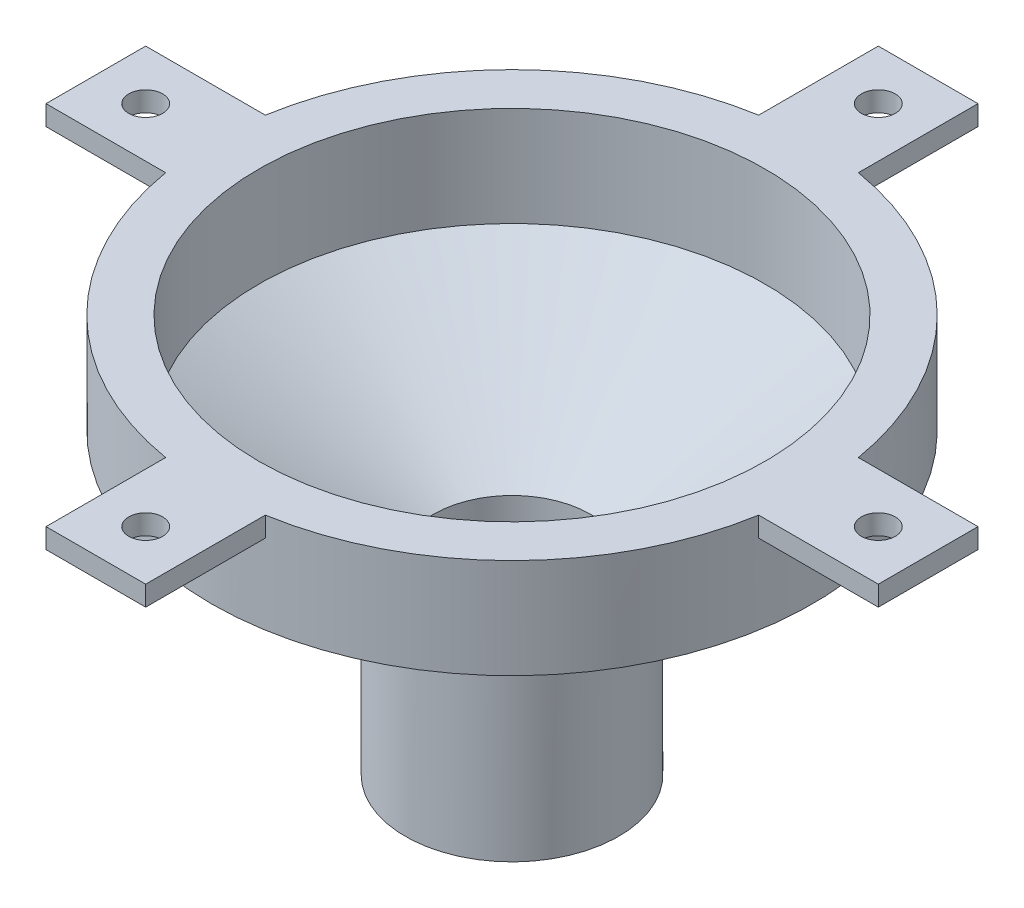
ISO-10303-21;
HEADER;
FILE_DESCRIPTION(('STEP AP214'),'2;1');
FILE_NAME('part.step','',(''),(''),'','','');
FILE_SCHEMA(('AUTOMOTIVE_DESIGN { 1 0 10303 214 1 1 1 1 }'));
ENDSEC;
DATA;
#1=APPLICATION_CONTEXT('core data for automotive mechanical design processes');
#2=APPLICATION_PROTOCOL_DEFINITION('international standard','automotive_design',2000,#1);
#3=PRODUCT_CONTEXT('',#1,'mechanical');
#4=PRODUCT('Part','Part','',(#3));
#5=PRODUCT_RELATED_PRODUCT_CATEGORY('part','',(#4));
#6=PRODUCT_DEFINITION_FORMATION('','',#4);
#7=PRODUCT_DEFINITION_CONTEXT('part definition',#1,'design');
#8=PRODUCT_DEFINITION('design','',#6,#7);
#9=PRODUCT_DEFINITION_SHAPE('','',#8);
#10=(LENGTH_UNIT() NAMED_UNIT(*) SI_UNIT(.MILLI.,.METRE.));
#11=(NAMED_UNIT(*) PLANE_ANGLE_UNIT() SI_UNIT($,.RADIAN.));
#12=(NAMED_UNIT(*) SI_UNIT($,.STERADIAN.) SOLID_ANGLE_UNIT());
#13=UNCERTAINTY_MEASURE_WITH_UNIT(LENGTH_MEASURE(1.E-05),#10,'distance_accuracy_value','');
#14=(GEOMETRIC_REPRESENTATION_CONTEXT(3) GLOBAL_UNCERTAINTY_ASSIGNED_CONTEXT((#13)) GLOBAL_UNIT_ASSIGNED_CONTEXT((#10,
#11,#12)) REPRESENTATION_CONTEXT('',''));
#15=CARTESIAN_POINT('',(0.,0.,0.));
#16=DIRECTION('',(0.,0.,1.));
#17=DIRECTION('',(1.,0.,0.));
#18=AXIS2_PLACEMENT_3D('',#15,#16,#17);
#19=CARTESIAN_POINT('',(0.,47.701,0.));
#20=DIRECTION('',(0.,-1.,0.));
#21=DIRECTION('',(0.,0.,-1.));
#22=AXIS2_PLACEMENT_3D('',#19,#20,#21);
#23=CYLINDRICAL_SURFACE('',#22,10.705);
#24=CARTESIAN_POINT('',(0.,-3.,0.));
#25=DIRECTION('',(0.,-1.,0.));
#26=DIRECTION('',(0.,0.,-1.));
#27=AXIS2_PLACEMENT_3D('',#24,#25,#26);
#28=CIRCLE('',#27,10.705);
#29=CARTESIAN_POINT('',(0.,-3.,-10.705));
#30=VERTEX_POINT('',#29);
#31=EDGE_CURVE('E12',#30,#30,#28,.T.);
#32=ORIENTED_EDGE('',*,*,#31,.F.);
#33=EDGE_LOOP('',(#32));
#34=FACE_BOUND('',#33,.T.);
#35=CARTESIAN_POINT('',(0.,15.7,0.));
#36=DIRECTION('',(0.,1.,0.));
#37=DIRECTION('',(0.,0.,1.));
#38=AXIS2_PLACEMENT_3D('',#35,#36,#37);
#39=CIRCLE('',#38,10.705);
#40=CARTESIAN_POINT('',(0.,15.7,10.705));
#41=VERTEX_POINT('',#40);
#42=EDGE_CURVE('E311',#41,#41,#39,.T.);
#43=ORIENTED_EDGE('',*,*,#42,.F.);
#44=EDGE_LOOP('',(#43));
#45=FACE_BOUND('',#44,.T.);
#46=ADVANCED_FACE('F36',(#34,#45),#23,.T.);
#47=CARTESIAN_POINT('',(0.,47.701,0.));
#48=DIRECTION('',(0.,-1.,0.));
#49=DIRECTION('',(0.,0.,-1.));
#50=AXIS2_PLACEMENT_3D('',#47,#48,#49);
#51=CYLINDRICAL_SURFACE('',#50,7.874);
#52=CARTESIAN_POINT('',(0.,-3.,0.));
#53=DIRECTION('',(0.,-1.,0.));
#54=DIRECTION('',(0.,0.,-1.));
#55=AXIS2_PLACEMENT_3D('',#52,#53,#54);
#56=CIRCLE('',#55,7.874);
#57=CARTESIAN_POINT('',(0.,-3.,-7.874));
#58=VERTEX_POINT('',#57);
#59=EDGE_CURVE('E44',#58,#58,#56,.T.);
#60=ORIENTED_EDGE('',*,*,#59,.T.);
#61=EDGE_LOOP('',(#60));
#62=FACE_BOUND('',#61,.T.);
#63=CARTESIAN_POINT('',(0.,15.7,0.));
#64=DIRECTION('',(0.,1.,0.));
#65=DIRECTION('',(0.,0.,1.));
#66=AXIS2_PLACEMENT_3D('',#63,#64,#65);
#67=CIRCLE('',#66,7.874);
#68=CARTESIAN_POINT('',(0.,15.7,7.874));
#69=VERTEX_POINT('',#68);
#70=EDGE_CURVE('E39',#69,#69,#67,.F.);
#71=ORIENTED_EDGE('',*,*,#70,.F.);
#72=EDGE_LOOP('',(#71));
#73=FACE_BOUND('',#72,.T.);
#74=ADVANCED_FACE('F323',(#62,#73),#51,.F.);
#75=CARTESIAN_POINT('',(0.,-3.,0.));
#76=DIRECTION('',(0.,-1.,0.));
#77=DIRECTION('',(0.,0.,-1.));
#78=AXIS2_PLACEMENT_3D('',#75,#76,#77);
#79=PLANE('',#78);
#80=ORIENTED_EDGE('',*,*,#31,.T.);
#81=EDGE_LOOP('',(#80));
#82=FACE_BOUND('',#81,.T.);
#83=ORIENTED_EDGE('',*,*,#59,.F.);
#84=EDGE_LOOP('',(#83));
#85=FACE_BOUND('',#84,.T.);
#86=ADVANCED_FACE('F325',(#82,#85),#79,.T.);
#87=CARTESIAN_POINT('',(0.,15.7,0.));
#88=DIRECTION('',(0.,1.,0.));
#89=DIRECTION('',(0.,0.,1.));
#90=AXIS2_PLACEMENT_3D('',#87,#88,#89);
#91=CONICAL_SURFACE('',#90,10.705,1.0471975511966);
#92=CARTESIAN_POINT('',(0.,26.9337928627572,0.));
#93=DIRECTION('',(0.,1.,0.));
#94=DIRECTION('',(0.,0.,1.));
#95=AXIS2_PLACEMENT_3D('',#92,#93,#94);
#96=CIRCLE('',#95,30.1625);
#97=CARTESIAN_POINT('',(0.,26.9337928627572,30.1625));
#98=VERTEX_POINT('',#97);
#99=EDGE_CURVE('E308',#98,#98,#96,.T.);
#100=ORIENTED_EDGE('',*,*,#99,.F.);
#101=EDGE_LOOP('',(#100));
#102=FACE_BOUND('',#101,.T.);
#103=ORIENTED_EDGE('',*,*,#42,.T.);
#104=EDGE_LOOP('',(#103));
#105=FACE_BOUND('',#104,.T.);
#106=ADVANCED_FACE('F330',(#102,#105),#91,.T.);
#107=CARTESIAN_POINT('',(0.,26.9337928627572,0.));
#108=DIRECTION('',(0.,1.,0.));
#109=DIRECTION('',(0.,0.,1.));
#110=AXIS2_PLACEMENT_3D('',#107,#108,#109);
#111=CONICAL_SURFACE('',#110,27.3315,1.0471975511966);
#112=CARTESIAN_POINT('',(0.,26.9337928627572,0.));
#113=DIRECTION('',(0.,1.,0.));
#114=DIRECTION('',(0.,0.,1.));
#115=AXIS2_PLACEMENT_3D('',#112,#113,#114);
#116=CIRCLE('',#115,27.3315);
#117=CARTESIAN_POINT('',(0.,26.9337928627572,27.3315));
#118=VERTEX_POINT('',#117);
#119=EDGE_CURVE('E304',#118,#118,#116,.T.);
#120=CARTESIAN_POINT('',(0.,15.7,7.874));
#121=CARTESIAN_POINT('',(0.,15.8170186756537,8.07668229166666));
#122=CARTESIAN_POINT('',(0.,15.9340373513074,8.27936458333333));
#123=CARTESIAN_POINT('',(0.,16.1680747026149,8.68472916666666));
#124=CARTESIAN_POINT('',(0.,16.2850933782686,8.88741145833333));
#125=CARTESIAN_POINT('',(0.,16.519130729576,9.29277604166667));
#126=CARTESIAN_POINT('',(0.,16.6361494052298,9.49545833333333));
#127=CARTESIAN_POINT('',(0.,16.8701867565372,9.90082291666666));
#128=CARTESIAN_POINT('',(0.,16.9872054321909,10.1035052083333));
#129=CARTESIAN_POINT('',(0.,17.2212427834984,10.5088697916667));
#130=CARTESIAN_POINT('',(0.,17.3382614591521,10.7115520833333));
#131=CARTESIAN_POINT('',(0.,17.5722988104595,11.1169166666667));
#132=CARTESIAN_POINT('',(0.,17.6893174861133,11.3195989583333));
#133=CARTESIAN_POINT('',(0.,17.9233548374207,11.7249635416667));
#134=CARTESIAN_POINT('',(0.,18.0403735130744,11.9276458333333));
#135=CARTESIAN_POINT('',(0.,18.2744108643819,12.3330104166667));
#136=CARTESIAN_POINT('',(0.,18.3914295400356,12.5356927083333));
#137=CARTESIAN_POINT('',(0.,18.625466891343,12.9410572916667));
#138=CARTESIAN_POINT('',(0.,18.7424855669967,13.1437395833333));
#139=CARTESIAN_POINT('',(0.,18.9765229183042,13.5491041666667));
#140=CARTESIAN_POINT('',(0.,19.0935415939579,13.7517864583333));
#141=CARTESIAN_POINT('',(0.,19.3275789452653,14.1571510416667));
#142=CARTESIAN_POINT('',(0.,19.4445976209191,14.3598333333333));
#143=CARTESIAN_POINT('',(0.,19.6786349722265,14.7651979166667));
#144=CARTESIAN_POINT('',(0.,19.7956536478802,14.9678802083333));
#145=CARTESIAN_POINT('',(0.,20.0296909991877,15.3732447916667));
#146=CARTESIAN_POINT('',(0.,20.1467096748414,15.5759270833333));
#147=CARTESIAN_POINT('',(0.,20.3807470261488,15.9812916666667));
#148=CARTESIAN_POINT('',(0.,20.4977657018025,16.1839739583333));
#149=CARTESIAN_POINT('',(0.,20.73180305311,16.5893385416667));
#150=CARTESIAN_POINT('',(0.,20.8488217287637,16.7920208333333));
#151=CARTESIAN_POINT('',(0.,21.0828590800711,17.1973854166667));
#152=CARTESIAN_POINT('',(0.,21.1998777557249,17.4000677083333));
#153=CARTESIAN_POINT('',(0.,21.4339151070323,17.8054322916667));
#154=CARTESIAN_POINT('',(0.,21.550933782686,18.0081145833333));
#155=CARTESIAN_POINT('',(0.,21.7849711339935,18.4134791666667));
#156=CARTESIAN_POINT('',(0.,21.9019898096472,18.6161614583333));
#157=CARTESIAN_POINT('',(0.,22.1360271609546,19.0215260416667));
#158=CARTESIAN_POINT('',(0.,22.2530458366084,19.2242083333333));
#159=CARTESIAN_POINT('',(0.,22.4870831879158,19.6295729166667));
#160=CARTESIAN_POINT('',(0.,22.6041018635695,19.8322552083333));
#161=CARTESIAN_POINT('',(0.,22.838139214877,20.2376197916667));
#162=CARTESIAN_POINT('',(0.,22.9551578905307,20.4403020833333));
#163=CARTESIAN_POINT('',(0.,23.1891952418381,20.8456666666667));
#164=CARTESIAN_POINT('',(0.,23.3062139174918,21.0483489583333));
#165=CARTESIAN_POINT('',(0.,23.5402512687993,21.4537135416667));
#166=CARTESIAN_POINT('',(0.,23.657269944453,21.6563958333333));
#167=CARTESIAN_POINT('',(0.,23.8913072957604,22.0617604166667));
#168=CARTESIAN_POINT('',(0.,24.0083259714142,22.2644427083333));
#169=CARTESIAN_POINT('',(0.,24.2423633227216,22.6698072916667));
#170=CARTESIAN_POINT('',(0.,24.3593819983753,22.8724895833333));
#171=CARTESIAN_POINT('',(0.,24.5934193496828,23.2778541666667));
#172=CARTESIAN_POINT('',(0.,24.7104380253365,23.4805364583333));
#173=CARTESIAN_POINT('',(0.,24.9444753766439,23.8859010416667));
#174=CARTESIAN_POINT('',(0.,25.0614940522977,24.0885833333333));
#175=CARTESIAN_POINT('',(0.,25.2955314036051,24.4939479166667));
#176=CARTESIAN_POINT('',(0.,25.4125500792588,24.6966302083333));
#177=CARTESIAN_POINT('',(0.,25.6465874305663,25.1019947916667));
#178=CARTESIAN_POINT('',(0.,25.76360610622,25.3046770833333));
#179=CARTESIAN_POINT('',(0.,25.9976434575274,25.7100416666667));
#180=CARTESIAN_POINT('',(0.,26.1146621331811,25.9127239583333));
#181=CARTESIAN_POINT('',(0.,26.3486994844886,26.3180885416667));
#182=CARTESIAN_POINT('',(0.,26.4657181601423,26.5207708333333));
#183=CARTESIAN_POINT('',(0.,26.6997555114497,26.9261354166667));
#184=CARTESIAN_POINT('',(0.,26.8167741871035,27.1288177083333));
#185=CARTESIAN_POINT('',(0.,26.9337928627572,27.3315));
#186=B_SPLINE_CURVE_WITH_KNOTS('',3,(#120,#121,#122,#123,#124,#125,#126,#127,#128,#129,#130,
#131,#132,#133,#134,#135,#136,#137,#138,#139,#140,#141,#142,#143,#144,#145,#146,#147,#148,#149,
#150,#151,#152,#153,#154,#155,#156,#157,#158,#159,#160,#161,#162,#163,#164,#165,#166,#167,#168,
#169,#170,#171,#172,#173,#174,#175,#176,#177,#178,#179,#180,#181,#182,#183,#184,#185),
.UNSPECIFIED.,.F.,.F.,(4,2,2,2,2,2,2,2,2,2,2,2,2,2,2,2,2,2,2,2,2,2,2,2,2,2,2,2,2,2,2,2,4),(0.,
0.702112053922319,1.40422410784465,2.10633616176696,2.80844821568929,3.51056026961161,
4.21267232353393,4.91478437745625,5.61689643137857,6.31900848530089,7.02112053922322,
7.72323259314554,8.42534464706786,9.12745670099018,9.8295687549125,10.5316808088348,
11.2337928627571,11.9359049166795,12.6380169706018,13.3401290245241,14.0422410784464,
14.7443531323688,15.4464651862911,16.1485772402134,16.8506892941357,17.552801348058,
18.2549134019804,18.9570254559027,19.659137509825,20.3612495637473,21.0633616176696,
21.765473671592,22.4675857255143),.UNSPECIFIED.);
#187=EDGE_CURVE('BSEAM320',#69,#118,#186,.T.);
#188=ORIENTED_EDGE('',*,*,#70,.T.);
#189=ORIENTED_EDGE('',*,*,#119,.T.);
#190=ORIENTED_EDGE('',*,*,#187,.T.);
#191=ORIENTED_EDGE('',*,*,#187,.F.);
#192=EDGE_LOOP('',(#188,#190,#189,#191));
#193=FACE_BOUND('',#192,.T.);
#194=ADVANCED_FACE('F320',(#193),#111,.F.);
#195=CARTESIAN_POINT('',(0.,26.9337928627572,0.));
#196=DIRECTION('',(0.,1.,0.));
#197=DIRECTION('',(0.,0.,1.));
#198=AXIS2_PLACEMENT_3D('',#195,#196,#197);
#199=PLANE('',#198);
#200=CARTESIAN_POINT('',(0.,26.9337928627572,0.));
#201=DIRECTION('',(0.,1.,0.));
#202=DIRECTION('',(0.,0.,1.));
#203=AXIS2_PLACEMENT_3D('',#200,#201,#202);
#204=CIRCLE('',#203,25.4);
#205=CARTESIAN_POINT('',(0.,26.9337928627572,25.4));
#206=VERTEX_POINT('',#205);
#207=EDGE_CURVE('E289',#206,#206,#204,.T.);
#208=ORIENTED_EDGE('',*,*,#207,.T.);
#209=EDGE_LOOP('',(#208));
#210=FACE_BOUND('',#209,.T.);
#211=ORIENTED_EDGE('',*,*,#119,.F.);
#212=EDGE_LOOP('',(#211));
#213=FACE_BOUND('',#212,.T.);
#214=ADVANCED_FACE('F340',(#210,#213),#199,.F.);
#215=CARTESIAN_POINT('',(0.,36.9337928627572,0.));
#216=DIRECTION('',(0.,1.,0.));
#217=DIRECTION('',(0.,0.,1.));
#218=AXIS2_PLACEMENT_3D('',#215,#216,#217);
#219=PLANE('',#218);
#220=CARTESIAN_POINT('',(0.,36.9337928627572,0.));
#221=DIRECTION('',(0.,1.,0.));
#222=DIRECTION('',(0.,0.,1.));
#223=AXIS2_PLACEMENT_3D('',#220,#221,#222);
#224=CIRCLE('',#223,30.1625);
#225=CARTESIAN_POINT('',(-29.7451913130509,36.9337928627572,5.00000000000002));
#226=VERTEX_POINT('',#225);
#227=CARTESIAN_POINT('',(-5.,36.9337928627572,29.7451913130509));
#228=VERTEX_POINT('',#227);
#229=EDGE_CURVE('E301',#226,#228,#224,.T.);
#230=ORIENTED_EDGE('',*,*,#229,.T.);
#231=DIRECTION('',(0.,0.,1.));
#232=VECTOR('',#231,1.);
#233=CARTESIAN_POINT('',(-5.00000000000001,36.9337928627572,0.));
#234=LINE('',#233,#232);
#235=CARTESIAN_POINT('',(-5.00000000000002,36.9337928627572,41.7451913130509));
#236=VERTEX_POINT('',#235);
#237=EDGE_CURVE('E243',#228,#236,#234,.T.);
#238=ORIENTED_EDGE('',*,*,#237,.T.);
#239=DIRECTION('',(1.,0.,0.));
#240=VECTOR('',#239,1.);
#241=CARTESIAN_POINT('',(0.,36.9337928627572,41.7451913130509));
#242=LINE('',#241,#240);
#243=CARTESIAN_POINT('',(5.00000000000002,36.9337928627572,41.7451913130509));
#244=VERTEX_POINT('',#243);
#245=EDGE_CURVE('E246',#236,#244,#242,.T.);
#246=ORIENTED_EDGE('',*,*,#245,.T.);
#247=DIRECTION('',(0.,0.,1.));
#248=VECTOR('',#247,1.);
#249=CARTESIAN_POINT('',(5.00000000000001,36.9337928627572,0.));
#250=LINE('',#249,#248);
#251=CARTESIAN_POINT('',(5.00000000000002,36.9337928627572,29.7451913130509));
#252=VERTEX_POINT('',#251);
#253=EDGE_CURVE('E229',#252,#244,#250,.T.);
#254=ORIENTED_EDGE('',*,*,#253,.F.);
#255=CARTESIAN_POINT('',(29.7451913130509,36.9337928627572,5.));
#256=VERTEX_POINT('',#255);
#257=EDGE_CURVE('E305',#252,#256,#224,.T.);
#258=ORIENTED_EDGE('',*,*,#257,.T.);
#259=DIRECTION('',(1.,0.,0.));
#260=VECTOR('',#259,1.);
#261=CARTESIAN_POINT('',(0.,36.9337928627572,5.00000000000001));
#262=LINE('',#261,#260);
#263=CARTESIAN_POINT('',(41.7451913130509,36.9337928627572,5.));
#264=VERTEX_POINT('',#263);
#265=EDGE_CURVE('E197',#256,#264,#262,.T.);
#266=ORIENTED_EDGE('',*,*,#265,.T.);
#267=DIRECTION('',(0.,0.,1.));
#268=VECTOR('',#267,1.);
#269=CARTESIAN_POINT('',(41.7451913130509,36.9337928627572,0.));
#270=LINE('',#269,#268);
#271=CARTESIAN_POINT('',(41.7451913130509,36.9337928627572,-5.));
#272=VERTEX_POINT('',#271);
#273=EDGE_CURVE('E209',#272,#264,#270,.T.);
#274=ORIENTED_EDGE('',*,*,#273,.F.);
#275=DIRECTION('',(1.,0.,0.));
#276=VECTOR('',#275,1.);
#277=CARTESIAN_POINT('',(0.,36.9337928627572,-5.00000000000001));
#278=LINE('',#277,#276);
#279=CARTESIAN_POINT('',(29.7451913130509,36.9337928627572,-5.));
#280=VERTEX_POINT('',#279);
#281=EDGE_CURVE('E58',#280,#272,#278,.T.);
#282=ORIENTED_EDGE('',*,*,#281,.F.);
#283=CARTESIAN_POINT('',(5.00000000000002,36.9337928627572,-29.7451913130509));
#284=VERTEX_POINT('',#283);
#285=EDGE_CURVE('E626',#280,#284,#224,.T.);
#286=ORIENTED_EDGE('',*,*,#285,.T.);
#287=DIRECTION('',(0.,0.,-1.));
#288=VECTOR('',#287,1.);
#289=CARTESIAN_POINT('',(5.00000000000002,36.9337928627572,0.));
#290=LINE('',#289,#288);
#291=CARTESIAN_POINT('',(5.00000000000002,36.9337928627572,-41.7451913130509));
#292=VERTEX_POINT('',#291);
#293=EDGE_CURVE('E174',#284,#292,#290,.T.);
#294=ORIENTED_EDGE('',*,*,#293,.T.);
#295=DIRECTION('',(1.,0.,0.));
#296=VECTOR('',#295,1.);
#297=CARTESIAN_POINT('',(0.,36.9337928627572,-41.7451913130509));
#298=LINE('',#297,#296);
#299=CARTESIAN_POINT('',(-5.00000000000002,36.9337928627572,-41.7451913130509));
#300=VERTEX_POINT('',#299);
#301=EDGE_CURVE('E182',#300,#292,#298,.T.);
#302=ORIENTED_EDGE('',*,*,#301,.F.);
#303=DIRECTION('',(0.,0.,-1.));
#304=VECTOR('',#303,1.);
#305=CARTESIAN_POINT('',(-5.00000000000002,36.9337928627572,0.));
#306=LINE('',#305,#304);
#307=CARTESIAN_POINT('',(-5.00000000000002,36.9337928627572,-29.7451913130509));
#308=VERTEX_POINT('',#307);
#309=EDGE_CURVE('E51',#308,#300,#306,.T.);
#310=ORIENTED_EDGE('',*,*,#309,.F.);
#311=CARTESIAN_POINT('',(-29.7451913130509,36.9337928627572,-4.99999999999997));
#312=VERTEX_POINT('',#311);
#313=EDGE_CURVE('E298',#308,#312,#224,.T.);
#314=ORIENTED_EDGE('',*,*,#313,.T.);
#315=DIRECTION('',(-1.,0.,0.));
#316=VECTOR('',#315,1.);
#317=CARTESIAN_POINT('',(0.,36.9337928627572,-5.00000000000001));
#318=LINE('',#317,#316);
#319=CARTESIAN_POINT('',(-41.7451913130509,36.9337928627572,-5.00000000000002));
#320=VERTEX_POINT('',#319);
#321=EDGE_CURVE('E278',#312,#320,#318,.T.);
#322=ORIENTED_EDGE('',*,*,#321,.T.);
#323=DIRECTION('',(0.,0.,1.));
#324=VECTOR('',#323,1.);
#325=CARTESIAN_POINT('',(-41.7451913130509,36.9337928627572,0.));
#326=LINE('',#325,#324);
#327=CARTESIAN_POINT('',(-41.7451913130509,36.9337928627572,5.00000000000002));
#328=VERTEX_POINT('',#327);
#329=EDGE_CURVE('E281',#320,#328,#326,.T.);
#330=ORIENTED_EDGE('',*,*,#329,.T.);
#331=DIRECTION('',(-1.,0.,0.));
#332=VECTOR('',#331,1.);
#333=CARTESIAN_POINT('',(0.,36.9337928627572,5.00000000000001));
#334=LINE('',#333,#332);
#335=EDGE_CURVE('E264',#226,#328,#334,.T.);
#336=ORIENTED_EDGE('',*,*,#335,.F.);
#337=EDGE_LOOP('',(#230,#238,#246,#254,#258,#266,#274,#282,#286,#294,#302,#310,#314,#322,#330,#336));
#338=FACE_BOUND('',#337,.T.);
#339=CARTESIAN_POINT('',(0.,36.9337928627572,0.));
#340=DIRECTION('',(0.,1.,0.));
#341=DIRECTION('',(0.,0.,1.));
#342=AXIS2_PLACEMENT_3D('',#339,#340,#341);
#343=CIRCLE('',#342,25.4);
#344=CARTESIAN_POINT('',(0.,36.9337928627572,25.4));
#345=VERTEX_POINT('',#344);
#346=EDGE_CURVE('E295',#345,#345,#343,.T.);
#347=ORIENTED_EDGE('',*,*,#346,.F.);
#348=EDGE_LOOP('',(#347));
#349=FACE_BOUND('',#348,.T.);
#350=CARTESIAN_POINT('',(-36.7451913130509,36.9337928627572,0.));
#351=DIRECTION('',(0.,1.,0.));
#352=DIRECTION('',(0.,0.,1.));
#353=AXIS2_PLACEMENT_3D('',#350,#351,#352);
#354=CIRCLE('',#353,1.7);
#355=CARTESIAN_POINT('',(-36.7451913130509,36.9337928627572,1.7));
#356=VERTEX_POINT('',#355);
#357=EDGE_CURVE('E254',#356,#356,#354,.T.);
#358=ORIENTED_EDGE('',*,*,#357,.F.);
#359=EDGE_LOOP('',(#358));
#360=FACE_BOUND('',#359,.T.);
#361=CARTESIAN_POINT('',(0.,36.9337928627572,36.7451913130509));
#362=DIRECTION('',(0.,1.,0.));
#363=DIRECTION('',(0.,0.,1.));
#364=AXIS2_PLACEMENT_3D('',#361,#362,#363);
#365=CIRCLE('',#364,1.7);
#366=CARTESIAN_POINT('',(0.,36.9337928627572,38.4451913130509));
#367=VERTEX_POINT('',#366);
#368=EDGE_CURVE('E217',#367,#367,#365,.T.);
#369=ORIENTED_EDGE('',*,*,#368,.F.);
#370=EDGE_LOOP('',(#369));
#371=FACE_BOUND('',#370,.T.);
#372=CARTESIAN_POINT('',(36.7451913130509,36.9337928627572,0.));
#373=DIRECTION('',(0.,1.,0.));
#374=DIRECTION('',(0.,0.,1.));
#375=AXIS2_PLACEMENT_3D('',#372,#373,#374);
#376=CIRCLE('',#375,1.7);
#377=CARTESIAN_POINT('',(36.7451913130509,36.9337928627572,1.7));
#378=VERTEX_POINT('',#377);
#379=EDGE_CURVE('E188',#378,#378,#376,.T.);
#380=ORIENTED_EDGE('',*,*,#379,.F.);
#381=EDGE_LOOP('',(#380));
#382=FACE_BOUND('',#381,.T.);
#383=CARTESIAN_POINT('',(0.,36.9337928627572,-36.7451913130509));
#384=DIRECTION('',(0.,1.,0.));
#385=DIRECTION('',(0.,0.,1.));
#386=AXIS2_PLACEMENT_3D('',#383,#384,#385);
#387=CIRCLE('',#386,1.7);
#388=CARTESIAN_POINT('',(0.,36.9337928627572,-35.0451913130509));
#389=VERTEX_POINT('',#388);
#390=EDGE_CURVE('E179',#389,#389,#387,.T.);
#391=ORIENTED_EDGE('',*,*,#390,.F.);
#392=EDGE_LOOP('',(#391));
#393=FACE_BOUND('',#392,.T.);
#394=ADVANCED_FACE('F345',(#338,#349,#360,#371,#382,#393),#219,.T.);
#395=CARTESIAN_POINT('',(0.,36.9337928627572,0.));
#396=DIRECTION('',(0.,-1.,0.));
#397=DIRECTION('',(0.,0.,-1.));
#398=AXIS2_PLACEMENT_3D('',#395,#396,#397);
#399=CYLINDRICAL_SURFACE('',#398,30.1625);
#400=CARTESIAN_POINT('',(0.,34.9337928627572,0.));
#401=DIRECTION('',(0.,1.,0.));
#402=DIRECTION('',(0.,0.,1.));
#403=AXIS2_PLACEMENT_3D('',#400,#401,#402);
#404=CIRCLE('',#403,30.1625);
#405=CARTESIAN_POINT('',(5.00000000000002,34.9337928627572,-29.7451913130509));
#406=VERTEX_POINT('',#405);
#407=CARTESIAN_POINT('',(-5.00000000000002,34.9337928627572,-29.7451913130509));
#408=VERTEX_POINT('',#407);
#409=EDGE_CURVE('E156',#406,#408,#404,.T.);
#410=ORIENTED_EDGE('',*,*,#409,.F.);
#411=DIRECTION('',(0.,1.,0.));
#412=VECTOR('',#411,1.);
#413=CARTESIAN_POINT('',(5.00000000000002,34.9337928627572,-29.7451913130509));
#414=LINE('',#413,#412);
#415=EDGE_CURVE('E189',#406,#284,#414,.T.);
#416=ORIENTED_EDGE('',*,*,#415,.T.);
#417=ORIENTED_EDGE('',*,*,#285,.F.);
#418=DIRECTION('',(0.,1.,0.));
#419=VECTOR('',#418,1.);
#420=CARTESIAN_POINT('',(29.7451913130509,34.9337928627572,-5.));
#421=LINE('',#420,#419);
#422=CARTESIAN_POINT('',(29.7451913130509,34.9337928627572,-5.));
#423=VERTEX_POINT('',#422);
#424=EDGE_CURVE('E221',#423,#280,#421,.T.);
#425=ORIENTED_EDGE('',*,*,#424,.F.);
#426=CARTESIAN_POINT('',(0.,34.9337928627572,0.));
#427=DIRECTION('',(0.,1.,0.));
#428=DIRECTION('',(0.,0.,1.));
#429=AXIS2_PLACEMENT_3D('',#426,#427,#428);
#430=CIRCLE('',#429,30.1625);
#431=CARTESIAN_POINT('',(29.7451913130509,34.9337928627572,5.));
#432=VERTEX_POINT('',#431);
#433=EDGE_CURVE('E201',#432,#423,#430,.T.);
#434=ORIENTED_EDGE('',*,*,#433,.F.);
#435=DIRECTION('',(0.,1.,0.));
#436=VECTOR('',#435,1.);
#437=CARTESIAN_POINT('',(29.7451913130509,34.9337928627572,5.));
#438=LINE('',#437,#436);
#439=EDGE_CURVE('E218',#432,#256,#438,.T.);
#440=ORIENTED_EDGE('',*,*,#439,.T.);
#441=ORIENTED_EDGE('',*,*,#257,.F.);
#442=DIRECTION('',(0.,1.,0.));
#443=VECTOR('',#442,1.);
#444=CARTESIAN_POINT('',(5.,34.9337928627572,29.7451913130509));
#445=LINE('',#444,#443);
#446=CARTESIAN_POINT('',(5.,34.9337928627572,29.7451913130509));
#447=VERTEX_POINT('',#446);
#448=EDGE_CURVE('E255',#447,#252,#445,.T.);
#449=ORIENTED_EDGE('',*,*,#448,.F.);
#450=CARTESIAN_POINT('',(0.,34.9337928627572,0.));
#451=DIRECTION('',(0.,1.,0.));
#452=DIRECTION('',(0.,0.,1.));
#453=AXIS2_PLACEMENT_3D('',#450,#451,#452);
#454=CIRCLE('',#453,30.1625);
#455=CARTESIAN_POINT('',(-5.,34.9337928627572,29.7451913130509));
#456=VERTEX_POINT('',#455);
#457=EDGE_CURVE('E237',#456,#447,#454,.T.);
#458=ORIENTED_EDGE('',*,*,#457,.F.);
#459=DIRECTION('',(0.,1.,0.));
#460=VECTOR('',#459,1.);
#461=CARTESIAN_POINT('',(-5.,34.9337928627572,29.7451913130509));
#462=LINE('',#461,#460);
#463=EDGE_CURVE('E251',#456,#228,#462,.T.);
#464=ORIENTED_EDGE('',*,*,#463,.T.);
#465=ORIENTED_EDGE('',*,*,#229,.F.);
#466=DIRECTION('',(0.,1.,0.));
#467=VECTOR('',#466,1.);
#468=CARTESIAN_POINT('',(-29.7451913130509,34.9337928627572,4.99999999999997));
#469=LINE('',#468,#467);
#470=CARTESIAN_POINT('',(-29.7451913130509,34.9337928627572,4.99999999999997));
#471=VERTEX_POINT('',#470);
#472=EDGE_CURVE('E290',#471,#226,#469,.T.);
#473=ORIENTED_EDGE('',*,*,#472,.F.);
#474=CARTESIAN_POINT('',(0.,34.9337928627572,0.));
#475=DIRECTION('',(0.,1.,0.));
#476=DIRECTION('',(0.,0.,1.));
#477=AXIS2_PLACEMENT_3D('',#474,#475,#476);
#478=CIRCLE('',#477,30.1625);
#479=CARTESIAN_POINT('',(-29.7451913130509,34.9337928627572,-4.99999999999997));
#480=VERTEX_POINT('',#479);
#481=EDGE_CURVE('E272',#480,#471,#478,.T.);
#482=ORIENTED_EDGE('',*,*,#481,.F.);
#483=DIRECTION('',(0.,1.,0.));
#484=VECTOR('',#483,1.);
#485=CARTESIAN_POINT('',(-29.7451913130509,34.9337928627572,-4.99999999999997));
#486=LINE('',#485,#484);
#487=EDGE_CURVE('E286',#480,#312,#486,.T.);
#488=ORIENTED_EDGE('',*,*,#487,.T.);
#489=ORIENTED_EDGE('',*,*,#313,.F.);
#490=DIRECTION('',(0.,1.,0.));
#491=VECTOR('',#490,1.);
#492=CARTESIAN_POINT('',(-5.00000000000002,34.9337928627572,-29.7451913130509));
#493=LINE('',#492,#491);
#494=EDGE_CURVE('E165',#408,#308,#493,.T.);
#495=ORIENTED_EDGE('',*,*,#494,.F.);
#496=EDGE_LOOP('',(#410,#416,#417,#425,#434,#440,#441,#449,#458,#464,#465,#473,#482,#488,#489,#495));
#497=FACE_BOUND('',#496,.T.);
#498=ORIENTED_EDGE('',*,*,#99,.T.);
#499=EDGE_LOOP('',(#498));
#500=FACE_BOUND('',#499,.T.);
#501=ADVANCED_FACE('F341',(#497,#500),#399,.T.);
#502=CARTESIAN_POINT('',(0.,36.9337928627572,0.));
#503=DIRECTION('',(0.,-1.,0.));
#504=DIRECTION('',(0.,0.,-1.));
#505=AXIS2_PLACEMENT_3D('',#502,#503,#504);
#506=CYLINDRICAL_SURFACE('',#505,25.4);
#507=ORIENTED_EDGE('',*,*,#346,.T.);
#508=EDGE_LOOP('',(#507));
#509=FACE_BOUND('',#508,.T.);
#510=ORIENTED_EDGE('',*,*,#207,.F.);
#511=EDGE_LOOP('',(#510));
#512=FACE_BOUND('',#511,.T.);
#513=ADVANCED_FACE('F344',(#509,#512),#506,.F.);
#514=CARTESIAN_POINT('',(0.,34.9337928627572,-5.00000000000001));
#515=DIRECTION('',(0.,0.,-1.));
#516=DIRECTION('',(-1.,0.,0.));
#517=AXIS2_PLACEMENT_3D('',#514,#515,#516);
#518=PLANE('',#517);
#519=ORIENTED_EDGE('',*,*,#321,.F.);
#520=ORIENTED_EDGE('',*,*,#487,.F.);
#521=DIRECTION('',(-1.,0.,0.));
#522=VECTOR('',#521,1.);
#523=CARTESIAN_POINT('',(0.,34.9337928627572,-5.00000000000001));
#524=LINE('',#523,#522);
#525=CARTESIAN_POINT('',(-41.7451913130509,34.9337928627572,-5.00000000000002));
#526=VERTEX_POINT('',#525);
#527=EDGE_CURVE('E263',#480,#526,#524,.T.);
#528=ORIENTED_EDGE('',*,*,#527,.T.);
#529=DIRECTION('',(0.,1.,0.));
#530=VECTOR('',#529,1.);
#531=CARTESIAN_POINT('',(-41.7451913130509,34.9337928627572,-5.00000000000002));
#532=LINE('',#531,#530);
#533=EDGE_CURVE('E275',#526,#320,#532,.T.);
#534=ORIENTED_EDGE('',*,*,#533,.T.);
#535=EDGE_LOOP('',(#519,#520,#528,#534));
#536=FACE_BOUND('',#535,.T.);
#537=ADVANCED_FACE('F354',(#536),#518,.T.);
#538=CARTESIAN_POINT('',(0.,34.9337928627572,5.00000000000001));
#539=DIRECTION('',(0.,0.,-1.));
#540=DIRECTION('',(-1.,0.,0.));
#541=AXIS2_PLACEMENT_3D('',#538,#539,#540);
#542=PLANE('',#541);
#543=ORIENTED_EDGE('',*,*,#335,.T.);
#544=DIRECTION('',(0.,1.,0.));
#545=VECTOR('',#544,1.);
#546=CARTESIAN_POINT('',(-41.7451913130509,34.9337928627572,5.00000000000002));
#547=LINE('',#546,#545);
#548=CARTESIAN_POINT('',(-41.7451913130509,34.9337928627572,5.00000000000002));
#549=VERTEX_POINT('',#548);
#550=EDGE_CURVE('E292',#549,#328,#547,.T.);
#551=ORIENTED_EDGE('',*,*,#550,.F.);
#552=DIRECTION('',(-1.,0.,0.));
#553=VECTOR('',#552,1.);
#554=CARTESIAN_POINT('',(0.,34.9337928627572,5.00000000000001));
#555=LINE('',#554,#553);
#556=EDGE_CURVE('E270',#471,#549,#555,.T.);
#557=ORIENTED_EDGE('',*,*,#556,.F.);
#558=ORIENTED_EDGE('',*,*,#472,.T.);
#559=EDGE_LOOP('',(#543,#551,#557,#558));
#560=FACE_BOUND('',#559,.T.);
#561=ADVANCED_FACE('F360',(#560),#542,.F.);
#562=CARTESIAN_POINT('',(-36.7451913130509,34.9337928627572,0.));
#563=DIRECTION('',(0.,1.,0.));
#564=DIRECTION('',(0.,0.,1.));
#565=AXIS2_PLACEMENT_3D('',#562,#563,#564);
#566=CYLINDRICAL_SURFACE('',#565,1.7);
#567=CARTESIAN_POINT('',(-36.7451913130509,34.9337928627572,0.));
#568=DIRECTION('',(0.,1.,0.));
#569=DIRECTION('',(0.,0.,1.));
#570=AXIS2_PLACEMENT_3D('',#567,#568,#569);
#571=CIRCLE('',#570,1.7);
#572=CARTESIAN_POINT('',(-36.7451913130509,34.9337928627572,1.7));
#573=VERTEX_POINT('',#572);
#574=EDGE_CURVE('E260',#573,#573,#571,.T.);
#575=ORIENTED_EDGE('',*,*,#574,.F.);
#576=EDGE_LOOP('',(#575));
#577=FACE_BOUND('',#576,.T.);
#578=ORIENTED_EDGE('',*,*,#357,.T.);
#579=EDGE_LOOP('',(#578));
#580=FACE_BOUND('',#579,.T.);
#581=ADVANCED_FACE('F356',(#577,#580),#566,.F.);
#582=CARTESIAN_POINT('',(-41.7451913130509,34.9337928627572,0.));
#583=DIRECTION('',(-1.,0.,0.));
#584=DIRECTION('',(0.,0.,1.));
#585=AXIS2_PLACEMENT_3D('',#582,#583,#584);
#586=PLANE('',#585);
#587=ORIENTED_EDGE('',*,*,#329,.F.);
#588=ORIENTED_EDGE('',*,*,#533,.F.);
#589=DIRECTION('',(0.,0.,1.));
#590=VECTOR('',#589,1.);
#591=CARTESIAN_POINT('',(-41.7451913130509,34.9337928627572,0.));
#592=LINE('',#591,#590);
#593=EDGE_CURVE('E267',#526,#549,#592,.T.);
#594=ORIENTED_EDGE('',*,*,#593,.T.);
#595=ORIENTED_EDGE('',*,*,#550,.T.);
#596=EDGE_LOOP('',(#587,#588,#594,#595));
#597=FACE_BOUND('',#596,.T.);
#598=ADVANCED_FACE('F359',(#597),#586,.T.);
#599=CARTESIAN_POINT('',(0.,34.9337928627572,0.));
#600=DIRECTION('',(0.,1.,0.));
#601=DIRECTION('',(0.,0.,1.));
#602=AXIS2_PLACEMENT_3D('',#599,#600,#601);
#603=PLANE('',#602);
#604=ORIENTED_EDGE('',*,*,#574,.T.);
#605=EDGE_LOOP('',(#604));
#606=FACE_BOUND('',#605,.T.);
#607=ORIENTED_EDGE('',*,*,#527,.F.);
#608=ORIENTED_EDGE('',*,*,#481,.T.);
#609=ORIENTED_EDGE('',*,*,#556,.T.);
#610=ORIENTED_EDGE('',*,*,#593,.F.);
#611=EDGE_LOOP('',(#607,#608,#609,#610));
#612=FACE_BOUND('',#611,.T.);
#613=ADVANCED_FACE('F367',(#606,#612),#603,.F.);
#614=CARTESIAN_POINT('',(-5.00000000000001,34.9337928627572,0.));
#615=DIRECTION('',(-1.,0.,0.));
#616=DIRECTION('',(0.,0.,1.));
#617=AXIS2_PLACEMENT_3D('',#614,#615,#616);
#618=PLANE('',#617);
#619=ORIENTED_EDGE('',*,*,#237,.F.);
#620=ORIENTED_EDGE('',*,*,#463,.F.);
#621=DIRECTION('',(0.,0.,1.));
#622=VECTOR('',#621,1.);
#623=CARTESIAN_POINT('',(-5.00000000000001,34.9337928627572,0.));
#624=LINE('',#623,#622);
#625=CARTESIAN_POINT('',(-5.00000000000002,34.9337928627572,41.7451913130509));
#626=VERTEX_POINT('',#625);
#627=EDGE_CURVE('E228',#456,#626,#624,.T.);
#628=ORIENTED_EDGE('',*,*,#627,.T.);
#629=DIRECTION('',(0.,1.,0.));
#630=VECTOR('',#629,1.);
#631=CARTESIAN_POINT('',(-5.00000000000002,34.9337928627572,41.7451913130509));
#632=LINE('',#631,#630);
#633=EDGE_CURVE('E240',#626,#236,#632,.T.);
#634=ORIENTED_EDGE('',*,*,#633,.T.);
#635=EDGE_LOOP('',(#619,#620,#628,#634));
#636=FACE_BOUND('',#635,.T.);
#637=ADVANCED_FACE('F374',(#636),#618,.T.);
#638=CARTESIAN_POINT('',(5.00000000000001,34.9337928627572,0.));
#639=DIRECTION('',(-1.,0.,0.));
#640=DIRECTION('',(0.,0.,1.));
#641=AXIS2_PLACEMENT_3D('',#638,#639,#640);
#642=PLANE('',#641);
#643=ORIENTED_EDGE('',*,*,#253,.T.);
#644=DIRECTION('',(0.,1.,0.));
#645=VECTOR('',#644,1.);
#646=CARTESIAN_POINT('',(5.00000000000002,34.9337928627572,41.7451913130509));
#647=LINE('',#646,#645);
#648=CARTESIAN_POINT('',(5.00000000000002,34.9337928627572,41.7451913130509));
#649=VERTEX_POINT('',#648);
#650=EDGE_CURVE('E257',#649,#244,#647,.T.);
#651=ORIENTED_EDGE('',*,*,#650,.F.);
#652=DIRECTION('',(0.,0.,1.));
#653=VECTOR('',#652,1.);
#654=CARTESIAN_POINT('',(5.00000000000001,34.9337928627572,0.));
#655=LINE('',#654,#653);
#656=EDGE_CURVE('E235',#447,#649,#655,.T.);
#657=ORIENTED_EDGE('',*,*,#656,.F.);
#658=ORIENTED_EDGE('',*,*,#448,.T.);
#659=EDGE_LOOP('',(#643,#651,#657,#658));
#660=FACE_BOUND('',#659,.T.);
#661=ADVANCED_FACE('F380',(#660),#642,.F.);
#662=CARTESIAN_POINT('',(0.,34.9337928627572,36.7451913130509));
#663=DIRECTION('',(0.,1.,0.));
#664=DIRECTION('',(0.,0.,1.));
#665=AXIS2_PLACEMENT_3D('',#662,#663,#664);
#666=CYLINDRICAL_SURFACE('',#665,1.7);
#667=CARTESIAN_POINT('',(0.,34.9337928627572,36.7451913130509));
#668=DIRECTION('',(0.,1.,0.));
#669=DIRECTION('',(0.,0.,1.));
#670=AXIS2_PLACEMENT_3D('',#667,#668,#669);
#671=CIRCLE('',#670,1.7);
#672=CARTESIAN_POINT('',(0.,34.9337928627572,38.4451913130509));
#673=VERTEX_POINT('',#672);
#674=EDGE_CURVE('E225',#673,#673,#671,.T.);
#675=ORIENTED_EDGE('',*,*,#674,.F.);
#676=EDGE_LOOP('',(#675));
#677=FACE_BOUND('',#676,.T.);
#678=ORIENTED_EDGE('',*,*,#368,.T.);
#679=EDGE_LOOP('',(#678));
#680=FACE_BOUND('',#679,.T.);
#681=ADVANCED_FACE('F376',(#677,#680),#666,.F.);
#682=CARTESIAN_POINT('',(0.,34.9337928627572,41.7451913130509));
#683=DIRECTION('',(0.,0.,1.));
#684=DIRECTION('',(1.,0.,0.));
#685=AXIS2_PLACEMENT_3D('',#682,#683,#684);
#686=PLANE('',#685);
#687=ORIENTED_EDGE('',*,*,#245,.F.);
#688=ORIENTED_EDGE('',*,*,#633,.F.);
#689=DIRECTION('',(1.,0.,0.));
#690=VECTOR('',#689,1.);
#691=CARTESIAN_POINT('',(0.,34.9337928627572,41.7451913130509));
#692=LINE('',#691,#690);
#693=EDGE_CURVE('E232',#626,#649,#692,.T.);
#694=ORIENTED_EDGE('',*,*,#693,.T.);
#695=ORIENTED_EDGE('',*,*,#650,.T.);
#696=EDGE_LOOP('',(#687,#688,#694,#695));
#697=FACE_BOUND('',#696,.T.);
#698=ADVANCED_FACE('F379',(#697),#686,.T.);
#699=CARTESIAN_POINT('',(0.,34.9337928627572,0.));
#700=DIRECTION('',(0.,1.,0.));
#701=DIRECTION('',(0.,0.,1.));
#702=AXIS2_PLACEMENT_3D('',#699,#700,#701);
#703=PLANE('',#702);
#704=ORIENTED_EDGE('',*,*,#674,.T.);
#705=EDGE_LOOP('',(#704));
#706=FACE_BOUND('',#705,.T.);
#707=ORIENTED_EDGE('',*,*,#627,.F.);
#708=ORIENTED_EDGE('',*,*,#457,.T.);
#709=ORIENTED_EDGE('',*,*,#656,.T.);
#710=ORIENTED_EDGE('',*,*,#693,.F.);
#711=EDGE_LOOP('',(#707,#708,#709,#710));
#712=FACE_BOUND('',#711,.T.);
#713=ADVANCED_FACE('F387',(#706,#712),#703,.F.);
#714=CARTESIAN_POINT('',(41.7451913130509,34.9337928627572,0.));
#715=DIRECTION('',(-1.,0.,0.));
#716=DIRECTION('',(0.,0.,1.));
#717=AXIS2_PLACEMENT_3D('',#714,#715,#716);
#718=PLANE('',#717);
#719=ORIENTED_EDGE('',*,*,#273,.T.);
#720=DIRECTION('',(0.,1.,0.));
#721=VECTOR('',#720,1.);
#722=CARTESIAN_POINT('',(41.7451913130509,34.9337928627572,5.));
#723=LINE('',#722,#721);
#724=CARTESIAN_POINT('',(41.7451913130509,34.9337928627572,5.));
#725=VERTEX_POINT('',#724);
#726=EDGE_CURVE('E215',#725,#264,#723,.T.);
#727=ORIENTED_EDGE('',*,*,#726,.F.);
#728=DIRECTION('',(0.,0.,1.));
#729=VECTOR('',#728,1.);
#730=CARTESIAN_POINT('',(41.7451913130509,34.9337928627572,0.));
#731=LINE('',#730,#729);
#732=CARTESIAN_POINT('',(41.7451913130509,34.9337928627572,-5.));
#733=VERTEX_POINT('',#732);
#734=EDGE_CURVE('E196',#733,#725,#731,.T.);
#735=ORIENTED_EDGE('',*,*,#734,.F.);
#736=DIRECTION('',(0.,1.,0.));
#737=VECTOR('',#736,1.);
#738=CARTESIAN_POINT('',(41.7451913130509,34.9337928627572,-5.));
#739=LINE('',#738,#737);
#740=EDGE_CURVE('E206',#733,#272,#739,.T.);
#741=ORIENTED_EDGE('',*,*,#740,.T.);
#742=EDGE_LOOP('',(#719,#727,#735,#741));
#743=FACE_BOUND('',#742,.T.);
#744=ADVANCED_FACE('F394',(#743),#718,.F.);
#745=CARTESIAN_POINT('',(0.,34.9337928627572,5.00000000000001));
#746=DIRECTION('',(0.,0.,1.));
#747=DIRECTION('',(1.,0.,0.));
#748=AXIS2_PLACEMENT_3D('',#745,#746,#747);
#749=PLANE('',#748);
#750=ORIENTED_EDGE('',*,*,#265,.F.);
#751=ORIENTED_EDGE('',*,*,#439,.F.);
#752=DIRECTION('',(1.,0.,0.));
#753=VECTOR('',#752,1.);
#754=CARTESIAN_POINT('',(0.,34.9337928627572,5.00000000000001));
#755=LINE('',#754,#753);
#756=EDGE_CURVE('E203',#432,#725,#755,.T.);
#757=ORIENTED_EDGE('',*,*,#756,.T.);
#758=ORIENTED_EDGE('',*,*,#726,.T.);
#759=EDGE_LOOP('',(#750,#751,#757,#758));
#760=FACE_BOUND('',#759,.T.);
#761=ADVANCED_FACE('F400',(#760),#749,.T.);
#762=CARTESIAN_POINT('',(36.7451913130509,34.9337928627572,0.));
#763=DIRECTION('',(0.,1.,0.));
#764=DIRECTION('',(0.,0.,1.));
#765=AXIS2_PLACEMENT_3D('',#762,#763,#764);
#766=CYLINDRICAL_SURFACE('',#765,1.7);
#767=CARTESIAN_POINT('',(36.7451913130509,34.9337928627572,0.));
#768=DIRECTION('',(0.,1.,0.));
#769=DIRECTION('',(0.,0.,1.));
#770=AXIS2_PLACEMENT_3D('',#767,#768,#769);
#771=CIRCLE('',#770,1.7);
#772=CARTESIAN_POINT('',(36.7451913130509,34.9337928627572,1.7));
#773=VERTEX_POINT('',#772);
#774=EDGE_CURVE('E193',#773,#773,#771,.T.);
#775=ORIENTED_EDGE('',*,*,#774,.F.);
#776=EDGE_LOOP('',(#775));
#777=FACE_BOUND('',#776,.T.);
#778=ORIENTED_EDGE('',*,*,#379,.T.);
#779=EDGE_LOOP('',(#778));
#780=FACE_BOUND('',#779,.T.);
#781=ADVANCED_FACE('F396',(#777,#780),#766,.F.);
#782=CARTESIAN_POINT('',(0.,34.9337928627572,-5.00000000000001));
#783=DIRECTION('',(0.,0.,1.));
#784=DIRECTION('',(1.,0.,0.));
#785=AXIS2_PLACEMENT_3D('',#782,#783,#784);
#786=PLANE('',#785);
#787=ORIENTED_EDGE('',*,*,#281,.T.);
#788=ORIENTED_EDGE('',*,*,#740,.F.);
#789=DIRECTION('',(1.,0.,0.));
#790=VECTOR('',#789,1.);
#791=CARTESIAN_POINT('',(0.,34.9337928627572,-5.00000000000001));
#792=LINE('',#791,#790);
#793=EDGE_CURVE('E199',#423,#733,#792,.T.);
#794=ORIENTED_EDGE('',*,*,#793,.F.);
#795=ORIENTED_EDGE('',*,*,#424,.T.);
#796=EDGE_LOOP('',(#787,#788,#794,#795));
#797=FACE_BOUND('',#796,.T.);
#798=ADVANCED_FACE('F399',(#797),#786,.F.);
#799=CARTESIAN_POINT('',(0.,34.9337928627572,0.));
#800=DIRECTION('',(0.,1.,0.));
#801=DIRECTION('',(0.,0.,1.));
#802=AXIS2_PLACEMENT_3D('',#799,#800,#801);
#803=PLANE('',#802);
#804=ORIENTED_EDGE('',*,*,#774,.T.);
#805=EDGE_LOOP('',(#804));
#806=FACE_BOUND('',#805,.T.);
#807=ORIENTED_EDGE('',*,*,#734,.T.);
#808=ORIENTED_EDGE('',*,*,#756,.F.);
#809=ORIENTED_EDGE('',*,*,#433,.T.);
#810=ORIENTED_EDGE('',*,*,#793,.T.);
#811=EDGE_LOOP('',(#807,#808,#809,#810));
#812=FACE_BOUND('',#811,.T.);
#813=ADVANCED_FACE('F407',(#806,#812),#803,.F.);
#814=CARTESIAN_POINT('',(0.,34.9337928627572,-41.7451913130509));
#815=DIRECTION('',(0.,0.,1.));
#816=DIRECTION('',(1.,0.,0.));
#817=AXIS2_PLACEMENT_3D('',#814,#815,#816);
#818=PLANE('',#817);
#819=ORIENTED_EDGE('',*,*,#301,.T.);
#820=DIRECTION('',(0.,1.,0.));
#821=VECTOR('',#820,1.);
#822=CARTESIAN_POINT('',(5.00000000000002,34.9337928627572,-41.7451913130509));
#823=LINE('',#822,#821);
#824=CARTESIAN_POINT('',(5.00000000000002,34.9337928627572,-41.7451913130509));
#825=VERTEX_POINT('',#824);
#826=EDGE_CURVE('E169',#825,#292,#823,.T.);
#827=ORIENTED_EDGE('',*,*,#826,.F.);
#828=DIRECTION('',(1.,0.,0.));
#829=VECTOR('',#828,1.);
#830=CARTESIAN_POINT('',(0.,34.9337928627572,-41.7451913130509));
#831=LINE('',#830,#829);
#832=CARTESIAN_POINT('',(-5.00000000000002,34.9337928627572,-41.7451913130509));
#833=VERTEX_POINT('',#832);
#834=EDGE_CURVE('E153',#833,#825,#831,.T.);
#835=ORIENTED_EDGE('',*,*,#834,.F.);
#836=DIRECTION('',(0.,1.,0.));
#837=VECTOR('',#836,1.);
#838=CARTESIAN_POINT('',(-5.00000000000002,34.9337928627572,-41.7451913130509));
#839=LINE('',#838,#837);
#840=EDGE_CURVE('E161',#833,#300,#839,.T.);
#841=ORIENTED_EDGE('',*,*,#840,.T.);
#842=EDGE_LOOP('',(#819,#827,#835,#841));
#843=FACE_BOUND('',#842,.T.);
#844=ADVANCED_FACE('F168',(#843),#818,.F.);
#845=CARTESIAN_POINT('',(5.00000000000002,34.9337928627572,0.));
#846=DIRECTION('',(1.,0.,0.));
#847=DIRECTION('',(0.,0.,-1.));
#848=AXIS2_PLACEMENT_3D('',#845,#846,#847);
#849=PLANE('',#848);
#850=ORIENTED_EDGE('',*,*,#293,.F.);
#851=ORIENTED_EDGE('',*,*,#415,.F.);
#852=DIRECTION('',(0.,0.,-1.));
#853=VECTOR('',#852,1.);
#854=CARTESIAN_POINT('',(5.00000000000002,34.9337928627572,0.));
#855=LINE('',#854,#853);
#856=EDGE_CURVE('E166',#406,#825,#855,.T.);
#857=ORIENTED_EDGE('',*,*,#856,.T.);
#858=ORIENTED_EDGE('',*,*,#826,.T.);
#859=EDGE_LOOP('',(#850,#851,#857,#858));
#860=FACE_BOUND('',#859,.T.);
#861=ADVANCED_FACE('F418',(#860),#849,.T.);
#862=CARTESIAN_POINT('',(0.,34.9337928627572,-36.7451913130509));
#863=DIRECTION('',(0.,1.,0.));
#864=DIRECTION('',(0.,0.,1.));
#865=AXIS2_PLACEMENT_3D('',#862,#863,#864);
#866=CYLINDRICAL_SURFACE('',#865,1.7);
#867=CARTESIAN_POINT('',(0.,34.9337928627572,-36.7451913130509));
#868=DIRECTION('',(0.,1.,0.));
#869=DIRECTION('',(0.,0.,1.));
#870=AXIS2_PLACEMENT_3D('',#867,#868,#869);
#871=CIRCLE('',#870,1.7);
#872=CARTESIAN_POINT('',(0.,34.9337928627572,-35.0451913130509));
#873=VERTEX_POINT('',#872);
#874=EDGE_CURVE('E171',#873,#873,#871,.T.);
#875=ORIENTED_EDGE('',*,*,#874,.F.);
#876=EDGE_LOOP('',(#875));
#877=FACE_BOUND('',#876,.T.);
#878=ORIENTED_EDGE('',*,*,#390,.T.);
#879=EDGE_LOOP('',(#878));
#880=FACE_BOUND('',#879,.T.);
#881=ADVANCED_FACE('F415',(#877,#880),#866,.F.);
#882=CARTESIAN_POINT('',(-5.00000000000002,34.9337928627572,0.));
#883=DIRECTION('',(1.,0.,0.));
#884=DIRECTION('',(0.,0.,-1.));
#885=AXIS2_PLACEMENT_3D('',#882,#883,#884);
#886=PLANE('',#885);
#887=ORIENTED_EDGE('',*,*,#309,.T.);
#888=ORIENTED_EDGE('',*,*,#840,.F.);
#889=DIRECTION('',(0.,0.,-1.));
#890=VECTOR('',#889,1.);
#891=CARTESIAN_POINT('',(-5.00000000000002,34.9337928627572,0.));
#892=LINE('',#891,#890);
#893=EDGE_CURVE('E148',#408,#833,#892,.T.);
#894=ORIENTED_EDGE('',*,*,#893,.F.);
#895=ORIENTED_EDGE('',*,*,#494,.T.);
#896=EDGE_LOOP('',(#887,#888,#894,#895));
#897=FACE_BOUND('',#896,.T.);
#898=ADVANCED_FACE('F162',(#897),#886,.F.);
#899=CARTESIAN_POINT('',(0.,34.9337928627572,0.));
#900=DIRECTION('',(0.,1.,0.));
#901=DIRECTION('',(0.,0.,1.));
#902=AXIS2_PLACEMENT_3D('',#899,#900,#901);
#903=PLANE('',#902);
#904=ORIENTED_EDGE('',*,*,#874,.T.);
#905=EDGE_LOOP('',(#904));
#906=FACE_BOUND('',#905,.T.);
#907=ORIENTED_EDGE('',*,*,#834,.T.);
#908=ORIENTED_EDGE('',*,*,#856,.F.);
#909=ORIENTED_EDGE('',*,*,#409,.T.);
#910=ORIENTED_EDGE('',*,*,#893,.T.);
#911=EDGE_LOOP('',(#907,#908,#909,#910));
#912=FACE_BOUND('',#911,.T.);
#913=ADVANCED_FACE('F150',(#906,#912),#903,.F.);
#914=CLOSED_SHELL('',(#46,#74,#86,#106,#194,#214,#394,#501,#513,#537,#561,#581,#598,#613,#637,
#661,#681,#698,#713,#744,#761,#781,#798,#813,#844,#861,#881,#898,#913));
#915=MANIFOLD_SOLID_BREP('B2',#914);
#916=ADVANCED_BREP_SHAPE_REPRESENTATION('',(#18,#915),#14);
#917=SHAPE_DEFINITION_REPRESENTATION(#9,#916);
ENDSEC;
END-ISO-10303-21;
